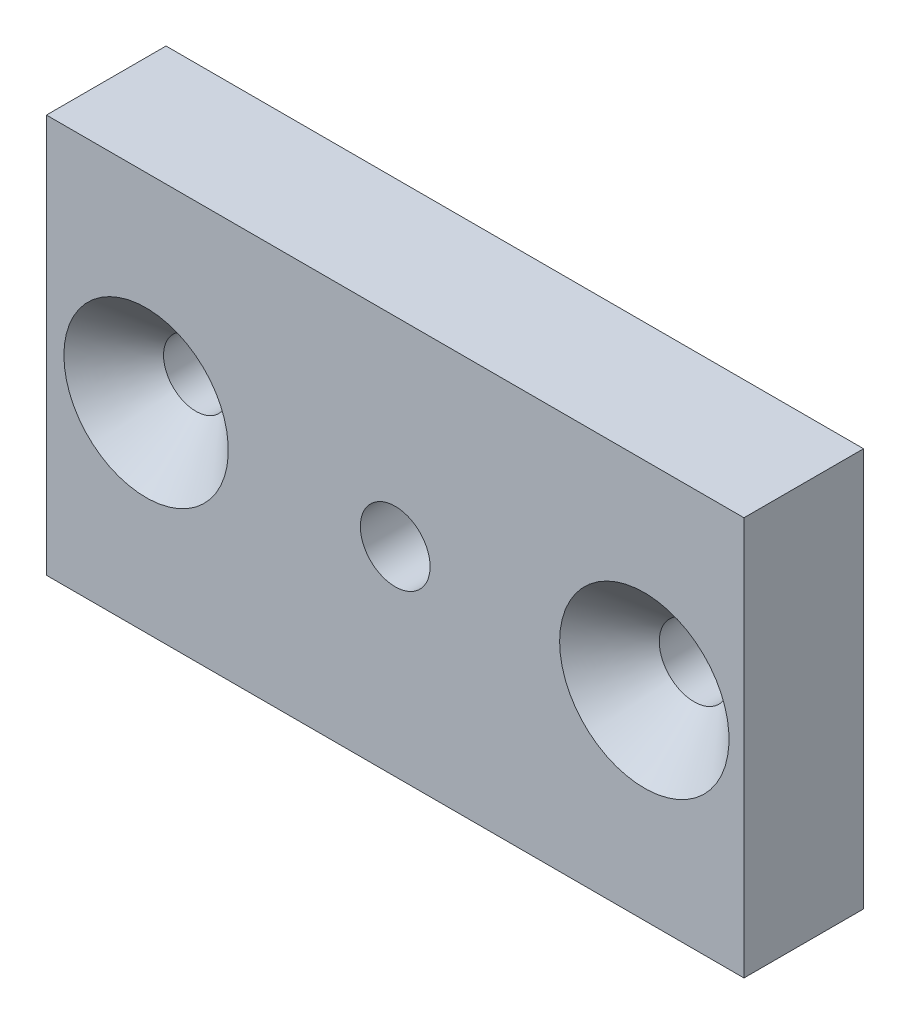
ISO-10303-21;
HEADER;
FILE_DESCRIPTION(('STEP AP214'),'2;1');
FILE_NAME('part.step','',(''),(''),'','','');
FILE_SCHEMA(('AUTOMOTIVE_DESIGN { 1 0 10303 214 1 1 1 1 }'));
ENDSEC;
DATA;
#1=APPLICATION_CONTEXT('core data for automotive mechanical design processes');
#2=APPLICATION_PROTOCOL_DEFINITION('international standard','automotive_design',2000,#1);
#3=PRODUCT_CONTEXT('',#1,'mechanical');
#4=PRODUCT('Part','Part','',(#3));
#5=PRODUCT_RELATED_PRODUCT_CATEGORY('part','',(#4));
#6=PRODUCT_DEFINITION_FORMATION('','',#4);
#7=PRODUCT_DEFINITION_CONTEXT('part definition',#1,'design');
#8=PRODUCT_DEFINITION('design','',#6,#7);
#9=PRODUCT_DEFINITION_SHAPE('','',#8);
#10=(LENGTH_UNIT() NAMED_UNIT(*) SI_UNIT(.MILLI.,.METRE.));
#11=(NAMED_UNIT(*) PLANE_ANGLE_UNIT() SI_UNIT($,.RADIAN.));
#12=(NAMED_UNIT(*) SI_UNIT($,.STERADIAN.) SOLID_ANGLE_UNIT());
#13=UNCERTAINTY_MEASURE_WITH_UNIT(LENGTH_MEASURE(1.E-05),#10,'distance_accuracy_value','');
#14=(GEOMETRIC_REPRESENTATION_CONTEXT(3) GLOBAL_UNCERTAINTY_ASSIGNED_CONTEXT((#13)) GLOBAL_UNIT_ASSIGNED_CONTEXT((#10,
#11,#12)) REPRESENTATION_CONTEXT('',''));
#15=CARTESIAN_POINT('',(0.,0.,0.));
#16=DIRECTION('',(0.,0.,1.));
#17=DIRECTION('',(1.,0.,0.));
#18=AXIS2_PLACEMENT_3D('',#15,#16,#17);
#19=CARTESIAN_POINT('',(17.5,10.,6.));
#20=DIRECTION('',(0.,0.,-1.));
#21=DIRECTION('',(-1.,0.,0.));
#22=AXIS2_PLACEMENT_3D('',#19,#20,#21);
#23=CYLINDRICAL_SURFACE('',#22,1.75);
#24=CARTESIAN_POINT('',(17.5,10.,6.));
#25=DIRECTION('',(0.,0.,1.));
#26=DIRECTION('',(1.,0.,0.));
#27=AXIS2_PLACEMENT_3D('',#24,#25,#26);
#28=CIRCLE('',#27,1.75);
#29=CARTESIAN_POINT('',(19.25,10.,6.));
#30=VERTEX_POINT('',#29);
#31=EDGE_CURVE('E184',#30,#30,#28,.T.);
#32=ORIENTED_EDGE('',*,*,#31,.T.);
#33=EDGE_LOOP('',(#32));
#34=FACE_BOUND('',#33,.T.);
#35=CARTESIAN_POINT('',(17.5,10.,2.5));
#36=DIRECTION('',(0.,0.,-1.));
#37=DIRECTION('',(-1.,0.,0.));
#38=AXIS2_PLACEMENT_3D('',#35,#36,#37);
#39=CIRCLE('',#38,1.75);
#40=CARTESIAN_POINT('',(15.75,10.,2.5));
#41=VERTEX_POINT('',#40);
#42=EDGE_CURVE('E46',#41,#41,#39,.T.);
#43=ORIENTED_EDGE('',*,*,#42,.T.);
#44=EDGE_LOOP('',(#43));
#45=FACE_BOUND('',#44,.T.);
#46=ADVANCED_FACE('F41',(#34,#45),#23,.F.);
#47=CARTESIAN_POINT('',(0.,0.,6.));
#48=DIRECTION('',(0.,0.,-1.));
#49=DIRECTION('',(-1.,0.,0.));
#50=AXIS2_PLACEMENT_3D('',#47,#48,#49);
#51=PLANE('',#50);
#52=CARTESIAN_POINT('',(30.,10.,6.));
#53=DIRECTION('',(0.,0.,-1.));
#54=DIRECTION('',(-1.,0.,0.));
#55=AXIS2_PLACEMENT_3D('',#52,#53,#54);
#56=CIRCLE('',#55,4.25000000000001);
#57=CARTESIAN_POINT('',(25.75,10.,6.));
#58=VERTEX_POINT('',#57);
#59=EDGE_CURVE('E51',#58,#58,#56,.T.);
#60=ORIENTED_EDGE('',*,*,#59,.T.);
#61=EDGE_LOOP('',(#60));
#62=FACE_BOUND('',#61,.T.);
#63=CARTESIAN_POINT('',(5.,10.,6.));
#64=DIRECTION('',(0.,0.,-1.));
#65=DIRECTION('',(-1.,0.,0.));
#66=AXIS2_PLACEMENT_3D('',#63,#64,#65);
#67=CIRCLE('',#66,4.12500000000001);
#68=CARTESIAN_POINT('',(0.874999999999994,10.,6.));
#69=VERTEX_POINT('',#68);
#70=EDGE_CURVE('E219',#69,#69,#67,.T.);
#71=ORIENTED_EDGE('',*,*,#70,.T.);
#72=EDGE_LOOP('',(#71));
#73=FACE_BOUND('',#72,.T.);
#74=DIRECTION('',(0.,-1.,0.));
#75=VECTOR('',#74,1.);
#76=CARTESIAN_POINT('',(0.,0.,6.));
#77=LINE('',#76,#75);
#78=CARTESIAN_POINT('',(0.,20.,6.));
#79=VERTEX_POINT('',#78);
#80=CARTESIAN_POINT('',(0.,0.,6.));
#81=VERTEX_POINT('',#80);
#82=EDGE_CURVE('E194',#79,#81,#77,.T.);
#83=ORIENTED_EDGE('',*,*,#82,.T.);
#84=DIRECTION('',(1.,0.,0.));
#85=VECTOR('',#84,1.);
#86=CARTESIAN_POINT('',(0.,0.,6.));
#87=LINE('',#86,#85);
#88=CARTESIAN_POINT('',(35.,0.,6.));
#89=VERTEX_POINT('',#88);
#90=EDGE_CURVE('E96',#81,#89,#87,.T.);
#91=ORIENTED_EDGE('',*,*,#90,.T.);
#92=DIRECTION('',(0.,1.,0.));
#93=VECTOR('',#92,1.);
#94=CARTESIAN_POINT('',(35.,0.,6.));
#95=LINE('',#94,#93);
#96=CARTESIAN_POINT('',(35.,20.,6.));
#97=VERTEX_POINT('',#96);
#98=EDGE_CURVE('E197',#89,#97,#95,.T.);
#99=ORIENTED_EDGE('',*,*,#98,.T.);
#100=DIRECTION('',(-1.,0.,0.));
#101=VECTOR('',#100,1.);
#102=CARTESIAN_POINT('',(0.,20.,6.));
#103=LINE('',#102,#101);
#104=EDGE_CURVE('E67',#97,#79,#103,.T.);
#105=ORIENTED_EDGE('',*,*,#104,.T.);
#106=EDGE_LOOP('',(#83,#91,#99,#105));
#107=FACE_BOUND('',#106,.T.);
#108=ORIENTED_EDGE('',*,*,#31,.F.);
#109=EDGE_LOOP('',(#108));
#110=FACE_BOUND('',#109,.T.);
#111=ADVANCED_FACE('F225',(#62,#73,#107,#110),#51,.F.);
#112=CARTESIAN_POINT('',(0.,0.,0.));
#113=DIRECTION('',(0.,0.,-1.));
#114=DIRECTION('',(-1.,0.,0.));
#115=AXIS2_PLACEMENT_3D('',#112,#113,#114);
#116=PLANE('',#115);
#117=DIRECTION('',(1.,0.,0.));
#118=VECTOR('',#117,1.);
#119=CARTESIAN_POINT('',(15.6236116251337,13.25,0.));
#120=LINE('',#119,#118);
#121=CARTESIAN_POINT('',(15.6236116251337,13.25,0.));
#122=VERTEX_POINT('',#121);
#123=CARTESIAN_POINT('',(19.3763883748663,13.25,0.));
#124=VERTEX_POINT('',#123);
#125=EDGE_CURVE('E58',#122,#124,#120,.T.);
#126=ORIENTED_EDGE('',*,*,#125,.F.);
#127=DIRECTION('',(0.5,0.866025403784439,0.));
#128=VECTOR('',#127,1.);
#129=CARTESIAN_POINT('',(13.7472232502674,10.,0.));
#130=LINE('',#129,#128);
#131=CARTESIAN_POINT('',(13.7472232502674,10.,0.));
#132=VERTEX_POINT('',#131);
#133=EDGE_CURVE('E151',#132,#122,#130,.T.);
#134=ORIENTED_EDGE('',*,*,#133,.F.);
#135=DIRECTION('',(-0.5,0.866025403784439,0.));
#136=VECTOR('',#135,1.);
#137=CARTESIAN_POINT('',(15.6236116251337,6.75000000000001,0.));
#138=LINE('',#137,#136);
#139=CARTESIAN_POINT('',(15.6236116251337,6.75000000000001,0.));
#140=VERTEX_POINT('',#139);
#141=EDGE_CURVE('E154',#140,#132,#138,.T.);
#142=ORIENTED_EDGE('',*,*,#141,.F.);
#143=DIRECTION('',(-1.,0.,0.));
#144=VECTOR('',#143,1.);
#145=CARTESIAN_POINT('',(19.3763883748663,6.75000000000001,0.));
#146=LINE('',#145,#144);
#147=CARTESIAN_POINT('',(19.3763883748663,6.75000000000001,0.));
#148=VERTEX_POINT('',#147);
#149=EDGE_CURVE('E170',#148,#140,#146,.T.);
#150=ORIENTED_EDGE('',*,*,#149,.F.);
#151=DIRECTION('',(-0.5,-0.866025403784439,0.));
#152=VECTOR('',#151,1.);
#153=CARTESIAN_POINT('',(21.2527767497326,10.,0.));
#154=LINE('',#153,#152);
#155=CARTESIAN_POINT('',(21.2527767497326,10.,0.));
#156=VERTEX_POINT('',#155);
#157=EDGE_CURVE('E167',#156,#148,#154,.T.);
#158=ORIENTED_EDGE('',*,*,#157,.F.);
#159=DIRECTION('',(0.5,-0.866025403784439,0.));
#160=VECTOR('',#159,1.);
#161=CARTESIAN_POINT('',(19.3763883748663,13.25,0.));
#162=LINE('',#161,#160);
#163=EDGE_CURVE('E165',#124,#156,#162,.T.);
#164=ORIENTED_EDGE('',*,*,#163,.F.);
#165=EDGE_LOOP('',(#126,#134,#142,#150,#158,#164));
#166=FACE_BOUND('',#165,.T.);
#167=CARTESIAN_POINT('',(30.,10.,0.));
#168=DIRECTION('',(0.,0.,1.));
#169=DIRECTION('',(1.,0.,0.));
#170=AXIS2_PLACEMENT_3D('',#167,#168,#169);
#171=CIRCLE('',#170,1.75);
#172=CARTESIAN_POINT('',(31.75,10.,0.));
#173=VERTEX_POINT('',#172);
#174=EDGE_CURVE('E187',#173,#173,#171,.T.);
#175=ORIENTED_EDGE('',*,*,#174,.T.);
#176=EDGE_LOOP('',(#175));
#177=FACE_BOUND('',#176,.T.);
#178=DIRECTION('',(0.,-1.,0.));
#179=VECTOR('',#178,1.);
#180=CARTESIAN_POINT('',(0.,0.,0.));
#181=LINE('',#180,#179);
#182=CARTESIAN_POINT('',(0.,20.,0.));
#183=VERTEX_POINT('',#182);
#184=CARTESIAN_POINT('',(0.,0.,0.));
#185=VERTEX_POINT('',#184);
#186=EDGE_CURVE('E193',#183,#185,#181,.T.);
#187=ORIENTED_EDGE('',*,*,#186,.F.);
#188=DIRECTION('',(-1.,0.,0.));
#189=VECTOR('',#188,1.);
#190=CARTESIAN_POINT('',(0.,20.,0.));
#191=LINE('',#190,#189);
#192=CARTESIAN_POINT('',(35.,20.,0.));
#193=VERTEX_POINT('',#192);
#194=EDGE_CURVE('E88',#193,#183,#191,.T.);
#195=ORIENTED_EDGE('',*,*,#194,.F.);
#196=DIRECTION('',(0.,1.,0.));
#197=VECTOR('',#196,1.);
#198=CARTESIAN_POINT('',(35.,0.,0.));
#199=LINE('',#198,#197);
#200=CARTESIAN_POINT('',(35.,0.,0.));
#201=VERTEX_POINT('',#200);
#202=EDGE_CURVE('E205',#201,#193,#199,.T.);
#203=ORIENTED_EDGE('',*,*,#202,.F.);
#204=DIRECTION('',(1.,0.,0.));
#205=VECTOR('',#204,1.);
#206=CARTESIAN_POINT('',(0.,0.,0.));
#207=LINE('',#206,#205);
#208=EDGE_CURVE('E203',#185,#201,#207,.T.);
#209=ORIENTED_EDGE('',*,*,#208,.F.);
#210=EDGE_LOOP('',(#187,#195,#203,#209));
#211=FACE_BOUND('',#210,.T.);
#212=CARTESIAN_POINT('',(5.,10.,0.));
#213=DIRECTION('',(0.,0.,1.));
#214=DIRECTION('',(1.,0.,0.));
#215=AXIS2_PLACEMENT_3D('',#212,#213,#214);
#216=CIRCLE('',#215,1.625);
#217=CARTESIAN_POINT('',(6.625,10.,0.));
#218=VERTEX_POINT('',#217);
#219=EDGE_CURVE('E190',#218,#218,#216,.T.);
#220=ORIENTED_EDGE('',*,*,#219,.T.);
#221=EDGE_LOOP('',(#220));
#222=FACE_BOUND('',#221,.T.);
#223=ADVANCED_FACE('F240',(#166,#177,#211,#222),#116,.T.);
#224=CARTESIAN_POINT('',(0.,0.,6.));
#225=DIRECTION('',(1.,0.,0.));
#226=DIRECTION('',(0.,0.,-1.));
#227=AXIS2_PLACEMENT_3D('',#224,#225,#226);
#228=PLANE('',#227);
#229=ORIENTED_EDGE('',*,*,#186,.T.);
#230=DIRECTION('',(0.,0.,-1.));
#231=VECTOR('',#230,1.);
#232=CARTESIAN_POINT('',(0.,0.,6.));
#233=LINE('',#232,#231);
#234=EDGE_CURVE('E214',#81,#185,#233,.T.);
#235=ORIENTED_EDGE('',*,*,#234,.F.);
#236=ORIENTED_EDGE('',*,*,#82,.F.);
#237=DIRECTION('',(0.,0.,-1.));
#238=VECTOR('',#237,1.);
#239=CARTESIAN_POINT('',(0.,20.,6.));
#240=LINE('',#239,#238);
#241=EDGE_CURVE('E200',#79,#183,#240,.T.);
#242=ORIENTED_EDGE('',*,*,#241,.T.);
#243=EDGE_LOOP('',(#229,#235,#236,#242));
#244=FACE_BOUND('',#243,.T.);
#245=ADVANCED_FACE('F243',(#244),#228,.F.);
#246=CARTESIAN_POINT('',(0.,0.,6.));
#247=DIRECTION('',(0.,1.,0.));
#248=DIRECTION('',(0.,0.,1.));
#249=AXIS2_PLACEMENT_3D('',#246,#247,#248);
#250=PLANE('',#249);
#251=ORIENTED_EDGE('',*,*,#208,.T.);
#252=DIRECTION('',(0.,0.,-1.));
#253=VECTOR('',#252,1.);
#254=CARTESIAN_POINT('',(35.,0.,6.));
#255=LINE('',#254,#253);
#256=EDGE_CURVE('E211',#89,#201,#255,.T.);
#257=ORIENTED_EDGE('',*,*,#256,.F.);
#258=ORIENTED_EDGE('',*,*,#90,.F.);
#259=ORIENTED_EDGE('',*,*,#234,.T.);
#260=EDGE_LOOP('',(#251,#257,#258,#259));
#261=FACE_BOUND('',#260,.T.);
#262=ADVANCED_FACE('F345',(#261),#250,.F.);
#263=CARTESIAN_POINT('',(35.,0.,6.));
#264=DIRECTION('',(-1.,0.,0.));
#265=DIRECTION('',(0.,0.,1.));
#266=AXIS2_PLACEMENT_3D('',#263,#264,#265);
#267=PLANE('',#266);
#268=ORIENTED_EDGE('',*,*,#202,.T.);
#269=DIRECTION('',(0.,0.,-1.));
#270=VECTOR('',#269,1.);
#271=CARTESIAN_POINT('',(35.,20.,6.));
#272=LINE('',#271,#270);
#273=EDGE_CURVE('E209',#97,#193,#272,.T.);
#274=ORIENTED_EDGE('',*,*,#273,.F.);
#275=ORIENTED_EDGE('',*,*,#98,.F.);
#276=ORIENTED_EDGE('',*,*,#256,.T.);
#277=EDGE_LOOP('',(#268,#274,#275,#276));
#278=FACE_BOUND('',#277,.T.);
#279=ADVANCED_FACE('F258',(#278),#267,.F.);
#280=CARTESIAN_POINT('',(0.,20.,6.));
#281=DIRECTION('',(0.,-1.,0.));
#282=DIRECTION('',(0.,0.,-1.));
#283=AXIS2_PLACEMENT_3D('',#280,#281,#282);
#284=PLANE('',#283);
#285=ORIENTED_EDGE('',*,*,#194,.T.);
#286=ORIENTED_EDGE('',*,*,#241,.F.);
#287=ORIENTED_EDGE('',*,*,#104,.F.);
#288=ORIENTED_EDGE('',*,*,#273,.T.);
#289=EDGE_LOOP('',(#285,#286,#287,#288));
#290=FACE_BOUND('',#289,.T.);
#291=ADVANCED_FACE('F251',(#290),#284,.F.);
#292=CARTESIAN_POINT('',(5.,10.,6.));
#293=DIRECTION('',(0.,0.,-1.));
#294=DIRECTION('',(-1.,0.,0.));
#295=AXIS2_PLACEMENT_3D('',#292,#293,#294);
#296=CYLINDRICAL_SURFACE('',#295,1.625);
#297=CARTESIAN_POINT('',(5.,10.,3.5));
#298=DIRECTION('',(0.,0.,-1.));
#299=DIRECTION('',(-1.,0.,0.));
#300=AXIS2_PLACEMENT_3D('',#297,#298,#299);
#301=CIRCLE('',#300,1.625);
#302=CARTESIAN_POINT('',(3.375,10.,3.5));
#303=VERTEX_POINT('',#302);
#304=EDGE_CURVE('E11',#303,#303,#301,.F.);
#305=ORIENTED_EDGE('',*,*,#304,.T.);
#306=EDGE_LOOP('',(#305));
#307=FACE_BOUND('',#306,.T.);
#308=ORIENTED_EDGE('',*,*,#219,.F.);
#309=EDGE_LOOP('',(#308));
#310=FACE_BOUND('',#309,.T.);
#311=ADVANCED_FACE('F236',(#307,#310),#296,.F.);
#312=CARTESIAN_POINT('',(30.,10.,6.));
#313=DIRECTION('',(0.,0.,-1.));
#314=DIRECTION('',(-1.,0.,0.));
#315=AXIS2_PLACEMENT_3D('',#312,#313,#314);
#316=CYLINDRICAL_SURFACE('',#315,1.75);
#317=CARTESIAN_POINT('',(30.,10.,3.5));
#318=DIRECTION('',(0.,0.,-1.));
#319=DIRECTION('',(-1.,0.,0.));
#320=AXIS2_PLACEMENT_3D('',#317,#318,#319);
#321=CIRCLE('',#320,1.75);
#322=CARTESIAN_POINT('',(28.25,10.,3.5));
#323=VERTEX_POINT('',#322);
#324=EDGE_CURVE('E216',#323,#323,#321,.F.);
#325=ORIENTED_EDGE('',*,*,#324,.T.);
#326=EDGE_LOOP('',(#325));
#327=FACE_BOUND('',#326,.T.);
#328=ORIENTED_EDGE('',*,*,#174,.F.);
#329=EDGE_LOOP('',(#328));
#330=FACE_BOUND('',#329,.T.);
#331=ADVANCED_FACE('F231',(#327,#330),#316,.F.);
#332=CARTESIAN_POINT('',(30.,10.,3.5));
#333=DIRECTION('',(0.,0.,1.));
#334=DIRECTION('',(1.,0.,0.));
#335=AXIS2_PLACEMENT_3D('',#332,#333,#334);
#336=CONICAL_SURFACE('',#335,1.75,0.78539816339745);
#337=ORIENTED_EDGE('',*,*,#59,.F.);
#338=EDGE_LOOP('',(#337));
#339=FACE_BOUND('',#338,.T.);
#340=ORIENTED_EDGE('',*,*,#324,.F.);
#341=EDGE_LOOP('',(#340));
#342=FACE_BOUND('',#341,.T.);
#343=ADVANCED_FACE('F228',(#339,#342),#336,.F.);
#344=CARTESIAN_POINT('',(5.,10.,3.5));
#345=DIRECTION('',(0.,0.,1.));
#346=DIRECTION('',(1.,0.,0.));
#347=AXIS2_PLACEMENT_3D('',#344,#345,#346);
#348=CONICAL_SURFACE('',#347,1.625,0.785398163397449);
#349=ORIENTED_EDGE('',*,*,#70,.F.);
#350=EDGE_LOOP('',(#349));
#351=FACE_BOUND('',#350,.T.);
#352=ORIENTED_EDGE('',*,*,#304,.F.);
#353=EDGE_LOOP('',(#352));
#354=FACE_BOUND('',#353,.T.);
#355=ADVANCED_FACE('F44',(#351,#354),#348,.F.);
#356=CARTESIAN_POINT('',(15.6236116251337,13.25,2.5));
#357=DIRECTION('',(0.,1.,0.));
#358=DIRECTION('',(0.,0.,1.));
#359=AXIS2_PLACEMENT_3D('',#356,#357,#358);
#360=PLANE('',#359);
#361=ORIENTED_EDGE('',*,*,#125,.T.);
#362=DIRECTION('',(0.,0.,-1.));
#363=VECTOR('',#362,1.);
#364=CARTESIAN_POINT('',(19.3763883748663,13.25,2.5));
#365=LINE('',#364,#363);
#366=CARTESIAN_POINT('',(19.3763883748663,13.25,2.5));
#367=VERTEX_POINT('',#366);
#368=EDGE_CURVE('E128',#367,#124,#365,.T.);
#369=ORIENTED_EDGE('',*,*,#368,.F.);
#370=DIRECTION('',(1.,0.,0.));
#371=VECTOR('',#370,1.);
#372=CARTESIAN_POINT('',(15.6236116251337,13.25,2.5));
#373=LINE('',#372,#371);
#374=CARTESIAN_POINT('',(15.6236116251337,13.25,2.5));
#375=VERTEX_POINT('',#374);
#376=EDGE_CURVE('E132',#375,#367,#373,.T.);
#377=ORIENTED_EDGE('',*,*,#376,.F.);
#378=DIRECTION('',(0.,0.,-1.));
#379=VECTOR('',#378,1.);
#380=CARTESIAN_POINT('',(15.6236116251337,13.25,2.5));
#381=LINE('',#380,#379);
#382=EDGE_CURVE('E175',#375,#122,#381,.T.);
#383=ORIENTED_EDGE('',*,*,#382,.T.);
#384=EDGE_LOOP('',(#361,#369,#377,#383));
#385=FACE_BOUND('',#384,.T.);
#386=ADVANCED_FACE('F130',(#385),#360,.F.);
#387=CARTESIAN_POINT('',(13.7472232502674,10.,2.5));
#388=DIRECTION('',(-0.866025403784439,0.5,0.));
#389=DIRECTION('',(-0.5,-0.866025403784439,0.));
#390=AXIS2_PLACEMENT_3D('',#387,#388,#389);
#391=PLANE('',#390);
#392=ORIENTED_EDGE('',*,*,#133,.T.);
#393=ORIENTED_EDGE('',*,*,#382,.F.);
#394=DIRECTION('',(0.5,0.866025403784439,0.));
#395=VECTOR('',#394,1.);
#396=CARTESIAN_POINT('',(13.7472232502674,10.,2.5));
#397=LINE('',#396,#395);
#398=CARTESIAN_POINT('',(13.7472232502674,10.,2.5));
#399=VERTEX_POINT('',#398);
#400=EDGE_CURVE('E138',#399,#375,#397,.T.);
#401=ORIENTED_EDGE('',*,*,#400,.F.);
#402=DIRECTION('',(0.,0.,-1.));
#403=VECTOR('',#402,1.);
#404=CARTESIAN_POINT('',(13.7472232502674,10.,2.5));
#405=LINE('',#404,#403);
#406=EDGE_CURVE('E177',#399,#132,#405,.T.);
#407=ORIENTED_EDGE('',*,*,#406,.T.);
#408=EDGE_LOOP('',(#392,#393,#401,#407));
#409=FACE_BOUND('',#408,.T.);
#410=ADVANCED_FACE('F271',(#409),#391,.F.);
#411=CARTESIAN_POINT('',(15.6236116251337,6.75000000000001,2.5));
#412=DIRECTION('',(-0.866025403784439,-0.5,0.));
#413=DIRECTION('',(0.5,-0.866025403784439,0.));
#414=AXIS2_PLACEMENT_3D('',#411,#412,#413);
#415=PLANE('',#414);
#416=ORIENTED_EDGE('',*,*,#141,.T.);
#417=ORIENTED_EDGE('',*,*,#406,.F.);
#418=DIRECTION('',(-0.5,0.866025403784439,0.));
#419=VECTOR('',#418,1.);
#420=CARTESIAN_POINT('',(15.6236116251337,6.75000000000001,2.5));
#421=LINE('',#420,#419);
#422=CARTESIAN_POINT('',(15.6236116251337,6.75000000000001,2.5));
#423=VERTEX_POINT('',#422);
#424=EDGE_CURVE('E161',#423,#399,#421,.T.);
#425=ORIENTED_EDGE('',*,*,#424,.F.);
#426=DIRECTION('',(0.,0.,-1.));
#427=VECTOR('',#426,1.);
#428=CARTESIAN_POINT('',(15.6236116251337,6.75000000000001,2.5));
#429=LINE('',#428,#427);
#430=EDGE_CURVE('E179',#423,#140,#429,.T.);
#431=ORIENTED_EDGE('',*,*,#430,.T.);
#432=EDGE_LOOP('',(#416,#417,#425,#431));
#433=FACE_BOUND('',#432,.T.);
#434=ADVANCED_FACE('F281',(#433),#415,.F.);
#435=CARTESIAN_POINT('',(19.3763883748663,6.75000000000001,2.5));
#436=DIRECTION('',(0.,-1.,0.));
#437=DIRECTION('',(0.,0.,-1.));
#438=AXIS2_PLACEMENT_3D('',#435,#436,#437);
#439=PLANE('',#438);
#440=ORIENTED_EDGE('',*,*,#149,.T.);
#441=ORIENTED_EDGE('',*,*,#430,.F.);
#442=DIRECTION('',(-1.,0.,0.));
#443=VECTOR('',#442,1.);
#444=CARTESIAN_POINT('',(19.3763883748663,6.75000000000001,2.5));
#445=LINE('',#444,#443);
#446=CARTESIAN_POINT('',(19.3763883748663,6.75000000000001,2.5));
#447=VERTEX_POINT('',#446);
#448=EDGE_CURVE('E158',#447,#423,#445,.T.);
#449=ORIENTED_EDGE('',*,*,#448,.F.);
#450=DIRECTION('',(0.,0.,-1.));
#451=VECTOR('',#450,1.);
#452=CARTESIAN_POINT('',(19.3763883748663,6.75000000000001,2.5));
#453=LINE('',#452,#451);
#454=EDGE_CURVE('E181',#447,#148,#453,.T.);
#455=ORIENTED_EDGE('',*,*,#454,.T.);
#456=EDGE_LOOP('',(#440,#441,#449,#455));
#457=FACE_BOUND('',#456,.T.);
#458=ADVANCED_FACE('F277',(#457),#439,.F.);
#459=CARTESIAN_POINT('',(21.2527767497326,10.,2.5));
#460=DIRECTION('',(0.866025403784439,-0.5,0.));
#461=DIRECTION('',(0.5,0.866025403784439,0.));
#462=AXIS2_PLACEMENT_3D('',#459,#460,#461);
#463=PLANE('',#462);
#464=ORIENTED_EDGE('',*,*,#157,.T.);
#465=ORIENTED_EDGE('',*,*,#454,.F.);
#466=DIRECTION('',(-0.5,-0.866025403784439,0.));
#467=VECTOR('',#466,1.);
#468=CARTESIAN_POINT('',(21.2527767497326,10.,2.5));
#469=LINE('',#468,#467);
#470=CARTESIAN_POINT('',(21.2527767497326,10.,2.5));
#471=VERTEX_POINT('',#470);
#472=EDGE_CURVE('E146',#471,#447,#469,.T.);
#473=ORIENTED_EDGE('',*,*,#472,.F.);
#474=DIRECTION('',(0.,0.,-1.));
#475=VECTOR('',#474,1.);
#476=CARTESIAN_POINT('',(21.2527767497326,10.,2.5));
#477=LINE('',#476,#475);
#478=EDGE_CURVE('E137',#471,#156,#477,.T.);
#479=ORIENTED_EDGE('',*,*,#478,.T.);
#480=EDGE_LOOP('',(#464,#465,#473,#479));
#481=FACE_BOUND('',#480,.T.);
#482=ADVANCED_FACE('F274',(#481),#463,.F.);
#483=CARTESIAN_POINT('',(19.3763883748663,13.25,2.5));
#484=DIRECTION('',(0.866025403784439,0.5,0.));
#485=DIRECTION('',(-0.5,0.866025403784439,0.));
#486=AXIS2_PLACEMENT_3D('',#483,#484,#485);
#487=PLANE('',#486);
#488=ORIENTED_EDGE('',*,*,#163,.T.);
#489=ORIENTED_EDGE('',*,*,#478,.F.);
#490=DIRECTION('',(0.5,-0.866025403784439,0.));
#491=VECTOR('',#490,1.);
#492=CARTESIAN_POINT('',(19.3763883748663,13.25,2.5));
#493=LINE('',#492,#491);
#494=EDGE_CURVE('E141',#367,#471,#493,.T.);
#495=ORIENTED_EDGE('',*,*,#494,.F.);
#496=ORIENTED_EDGE('',*,*,#368,.T.);
#497=EDGE_LOOP('',(#488,#489,#495,#496));
#498=FACE_BOUND('',#497,.T.);
#499=ADVANCED_FACE('F142',(#498),#487,.F.);
#500=CARTESIAN_POINT('',(0.,0.,2.5));
#501=DIRECTION('',(0.,0.,-1.));
#502=DIRECTION('',(-1.,0.,0.));
#503=AXIS2_PLACEMENT_3D('',#500,#501,#502);
#504=PLANE('',#503);
#505=ORIENTED_EDGE('',*,*,#42,.F.);
#506=EDGE_LOOP('',(#505));
#507=FACE_BOUND('',#506,.T.);
#508=ORIENTED_EDGE('',*,*,#376,.T.);
#509=ORIENTED_EDGE('',*,*,#494,.T.);
#510=ORIENTED_EDGE('',*,*,#472,.T.);
#511=ORIENTED_EDGE('',*,*,#448,.T.);
#512=ORIENTED_EDGE('',*,*,#424,.T.);
#513=ORIENTED_EDGE('',*,*,#400,.T.);
#514=EDGE_LOOP('',(#508,#509,#510,#511,#512,#513));
#515=FACE_BOUND('',#514,.T.);
#516=ADVANCED_FACE('F148',(#507,#515),#504,.T.);
#517=CLOSED_SHELL('',(#46,#111,#223,#245,#262,#279,#291,#311,#331,#343,#355,#386,#410,#434,#458,
#482,#499,#516));
#518=MANIFOLD_SOLID_BREP('B2',#517);
#519=ADVANCED_BREP_SHAPE_REPRESENTATION('',(#18,#518),#14);
#520=SHAPE_DEFINITION_REPRESENTATION(#9,#519);
ENDSEC;
END-ISO-10303-21;
